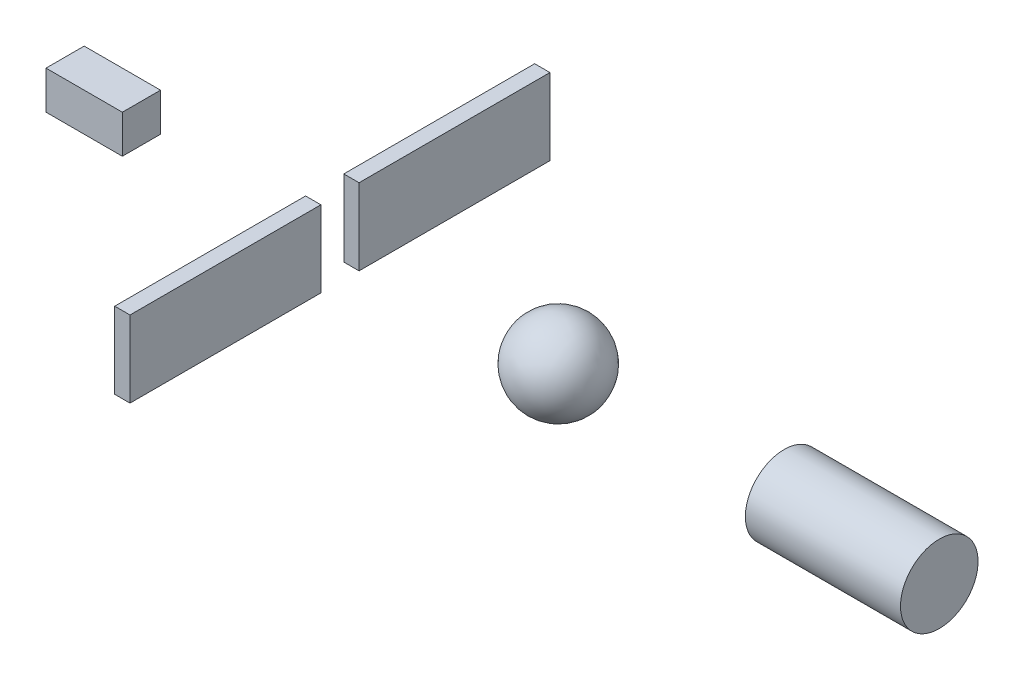
ISO-10303-21;
HEADER;
FILE_DESCRIPTION(('STEP AP214'),'2;1');
FILE_NAME('part.step','',(''),(''),'','','');
FILE_SCHEMA(('AUTOMOTIVE_DESIGN { 1 0 10303 214 1 1 1 1 }'));
ENDSEC;
DATA;
#1=APPLICATION_CONTEXT('core data for automotive mechanical design processes');
#2=APPLICATION_PROTOCOL_DEFINITION('international standard','automotive_design',2000,#1);
#3=PRODUCT_CONTEXT('',#1,'mechanical');
#4=PRODUCT('Part','Part','',(#3));
#5=PRODUCT_RELATED_PRODUCT_CATEGORY('part','',(#4));
#6=PRODUCT_DEFINITION_FORMATION('','',#4);
#7=PRODUCT_DEFINITION_CONTEXT('part definition',#1,'design');
#8=PRODUCT_DEFINITION('design','',#6,#7);
#9=PRODUCT_DEFINITION_SHAPE('','',#8);
#10=(LENGTH_UNIT() NAMED_UNIT(*) SI_UNIT(.MILLI.,.METRE.));
#11=(NAMED_UNIT(*) PLANE_ANGLE_UNIT() SI_UNIT($,.RADIAN.));
#12=(NAMED_UNIT(*) SI_UNIT($,.STERADIAN.) SOLID_ANGLE_UNIT());
#13=UNCERTAINTY_MEASURE_WITH_UNIT(LENGTH_MEASURE(1.E-05),#10,'distance_accuracy_value','');
#14=(GEOMETRIC_REPRESENTATION_CONTEXT(3) GLOBAL_UNCERTAINTY_ASSIGNED_CONTEXT((#13)) GLOBAL_UNIT_ASSIGNED_CONTEXT((#10,
#11,#12)) REPRESENTATION_CONTEXT('',''));
#15=CARTESIAN_POINT('',(0.,0.,0.));
#16=DIRECTION('',(0.,0.,1.));
#17=DIRECTION('',(1.,0.,0.));
#18=AXIS2_PLACEMENT_3D('',#15,#16,#17);
#19=CARTESIAN_POINT('',(9.99999999999998,50.,275.));
#20=DIRECTION('',(-1.,0.,0.));
#21=DIRECTION('',(0.,0.,1.));
#22=AXIS2_PLACEMENT_3D('',#19,#20,#21);
#23=PLANE('',#22);
#24=DIRECTION('',(0.,0.,-1.));
#25=VECTOR('',#24,1.);
#26=CARTESIAN_POINT('',(9.99999999999998,-50.,275.));
#27=LINE('',#26,#25);
#28=CARTESIAN_POINT('',(9.99999999999998,-50.,275.));
#29=VERTEX_POINT('',#28);
#30=CARTESIAN_POINT('',(10.,-50.,25.));
#31=VERTEX_POINT('',#30);
#32=EDGE_CURVE('E107',#29,#31,#27,.T.);
#33=ORIENTED_EDGE('',*,*,#32,.T.);
#34=DIRECTION('',(0.,-1.,0.));
#35=VECTOR('',#34,1.);
#36=CARTESIAN_POINT('',(10.,50.,25.));
#37=LINE('',#36,#35);
#38=CARTESIAN_POINT('',(10.,50.,25.));
#39=VERTEX_POINT('',#38);
#40=EDGE_CURVE('E12',#39,#31,#37,.T.);
#41=ORIENTED_EDGE('',*,*,#40,.F.);
#42=DIRECTION('',(0.,0.,-1.));
#43=VECTOR('',#42,1.);
#44=CARTESIAN_POINT('',(9.99999999999998,50.,275.));
#45=LINE('',#44,#43);
#46=CARTESIAN_POINT('',(9.99999999999998,50.,275.));
#47=VERTEX_POINT('',#46);
#48=EDGE_CURVE('E95',#47,#39,#45,.T.);
#49=ORIENTED_EDGE('',*,*,#48,.F.);
#50=DIRECTION('',(0.,-1.,0.));
#51=VECTOR('',#50,1.);
#52=CARTESIAN_POINT('',(9.99999999999998,50.,275.));
#53=LINE('',#52,#51);
#54=EDGE_CURVE('E103',#47,#29,#53,.T.);
#55=ORIENTED_EDGE('',*,*,#54,.T.);
#56=EDGE_LOOP('',(#33,#41,#49,#55));
#57=FACE_BOUND('',#56,.T.);
#58=ADVANCED_FACE('F44',(#57),#23,.F.);
#59=CARTESIAN_POINT('',(10.,50.,25.));
#60=DIRECTION('',(0.,0.,1.));
#61=DIRECTION('',(1.,0.,0.));
#62=AXIS2_PLACEMENT_3D('',#59,#60,#61);
#63=PLANE('',#62);
#64=DIRECTION('',(-1.,0.,0.));
#65=VECTOR('',#64,1.);
#66=CARTESIAN_POINT('',(10.,-50.,25.));
#67=LINE('',#66,#65);
#68=CARTESIAN_POINT('',(-9.99999999999998,-50.,25.));
#69=VERTEX_POINT('',#68);
#70=EDGE_CURVE('E99',#31,#69,#67,.T.);
#71=ORIENTED_EDGE('',*,*,#70,.T.);
#72=DIRECTION('',(0.,-1.,0.));
#73=VECTOR('',#72,1.);
#74=CARTESIAN_POINT('',(-9.99999999999998,50.,25.));
#75=LINE('',#74,#73);
#76=CARTESIAN_POINT('',(-9.99999999999998,50.,25.));
#77=VERTEX_POINT('',#76);
#78=EDGE_CURVE('E52',#77,#69,#75,.T.);
#79=ORIENTED_EDGE('',*,*,#78,.F.);
#80=DIRECTION('',(-1.,0.,0.));
#81=VECTOR('',#80,1.);
#82=CARTESIAN_POINT('',(10.,50.,25.));
#83=LINE('',#82,#81);
#84=EDGE_CURVE('E90',#39,#77,#83,.T.);
#85=ORIENTED_EDGE('',*,*,#84,.F.);
#86=ORIENTED_EDGE('',*,*,#40,.T.);
#87=EDGE_LOOP('',(#71,#79,#85,#86));
#88=FACE_BOUND('',#87,.T.);
#89=ADVANCED_FACE('F98',(#88),#63,.F.);
#90=CARTESIAN_POINT('',(-10.,50.,275.));
#91=DIRECTION('',(1.,0.,0.));
#92=DIRECTION('',(0.,0.,-1.));
#93=AXIS2_PLACEMENT_3D('',#90,#91,#92);
#94=PLANE('',#93);
#95=DIRECTION('',(0.,0.,1.));
#96=VECTOR('',#95,1.);
#97=CARTESIAN_POINT('',(-10.,-50.,275.));
#98=LINE('',#97,#96);
#99=CARTESIAN_POINT('',(-10.,-50.,275.));
#100=VERTEX_POINT('',#99);
#101=EDGE_CURVE('E77',#69,#100,#98,.T.);
#102=ORIENTED_EDGE('',*,*,#101,.T.);
#103=DIRECTION('',(0.,-1.,0.));
#104=VECTOR('',#103,1.);
#105=CARTESIAN_POINT('',(-10.,50.,275.));
#106=LINE('',#105,#104);
#107=CARTESIAN_POINT('',(-10.,50.,275.));
#108=VERTEX_POINT('',#107);
#109=EDGE_CURVE('E100',#108,#100,#106,.T.);
#110=ORIENTED_EDGE('',*,*,#109,.F.);
#111=DIRECTION('',(0.,0.,1.));
#112=VECTOR('',#111,1.);
#113=CARTESIAN_POINT('',(-10.,50.,275.));
#114=LINE('',#113,#112);
#115=EDGE_CURVE('E93',#77,#108,#114,.T.);
#116=ORIENTED_EDGE('',*,*,#115,.F.);
#117=ORIENTED_EDGE('',*,*,#78,.T.);
#118=EDGE_LOOP('',(#102,#110,#116,#117));
#119=FACE_BOUND('',#118,.T.);
#120=ADVANCED_FACE('F101',(#119),#94,.F.);
#121=CARTESIAN_POINT('',(9.99999999999998,50.,275.));
#122=DIRECTION('',(0.,0.,-1.));
#123=DIRECTION('',(-1.,0.,0.));
#124=AXIS2_PLACEMENT_3D('',#121,#122,#123);
#125=PLANE('',#124);
#126=DIRECTION('',(1.,0.,0.));
#127=VECTOR('',#126,1.);
#128=CARTESIAN_POINT('',(9.99999999999998,-50.,275.));
#129=LINE('',#128,#127);
#130=EDGE_CURVE('E83',#100,#29,#129,.T.);
#131=ORIENTED_EDGE('',*,*,#130,.T.);
#132=ORIENTED_EDGE('',*,*,#54,.F.);
#133=DIRECTION('',(1.,0.,0.));
#134=VECTOR('',#133,1.);
#135=CARTESIAN_POINT('',(9.99999999999998,50.,275.));
#136=LINE('',#135,#134);
#137=EDGE_CURVE('E60',#108,#47,#136,.T.);
#138=ORIENTED_EDGE('',*,*,#137,.F.);
#139=ORIENTED_EDGE('',*,*,#109,.T.);
#140=EDGE_LOOP('',(#131,#132,#138,#139));
#141=FACE_BOUND('',#140,.T.);
#142=ADVANCED_FACE('F114',(#141),#125,.F.);
#143=CARTESIAN_POINT('',(0.,50.,0.));
#144=DIRECTION('',(0.,1.,0.));
#145=DIRECTION('',(0.,0.,1.));
#146=AXIS2_PLACEMENT_3D('',#143,#144,#145);
#147=PLANE('',#146);
#148=ORIENTED_EDGE('',*,*,#48,.T.);
#149=ORIENTED_EDGE('',*,*,#84,.T.);
#150=ORIENTED_EDGE('',*,*,#115,.T.);
#151=ORIENTED_EDGE('',*,*,#137,.T.);
#152=EDGE_LOOP('',(#148,#149,#150,#151));
#153=FACE_BOUND('',#152,.T.);
#154=ADVANCED_FACE('F91',(#153),#147,.T.);
#155=CARTESIAN_POINT('',(0.,-50.,0.));
#156=DIRECTION('',(0.,1.,0.));
#157=DIRECTION('',(0.,0.,1.));
#158=AXIS2_PLACEMENT_3D('',#155,#156,#157);
#159=PLANE('',#158);
#160=ORIENTED_EDGE('',*,*,#32,.F.);
#161=ORIENTED_EDGE('',*,*,#130,.F.);
#162=ORIENTED_EDGE('',*,*,#101,.F.);
#163=ORIENTED_EDGE('',*,*,#70,.F.);
#164=EDGE_LOOP('',(#160,#161,#162,#163));
#165=FACE_BOUND('',#164,.T.);
#166=ADVANCED_FACE('F117',(#165),#159,.F.);
#167=CLOSED_SHELL('',(#58,#89,#120,#142,#154,#166));
#168=MANIFOLD_SOLID_BREP('B2',#167);
#169=CARTESIAN_POINT('',(-10.,50.,-275.));
#170=DIRECTION('',(1.,0.,0.));
#171=DIRECTION('',(0.,0.,-1.));
#172=AXIS2_PLACEMENT_3D('',#169,#170,#171);
#173=PLANE('',#172);
#174=DIRECTION('',(0.,0.,1.));
#175=VECTOR('',#174,1.);
#176=CARTESIAN_POINT('',(-10.,-50.,-275.));
#177=LINE('',#176,#175);
#178=CARTESIAN_POINT('',(-10.,-50.,-275.));
#179=VERTEX_POINT('',#178);
#180=CARTESIAN_POINT('',(-9.99999999999999,-50.,-25.));
#181=VERTEX_POINT('',#180);
#182=EDGE_CURVE('E237',#179,#181,#177,.T.);
#183=ORIENTED_EDGE('',*,*,#182,.T.);
#184=DIRECTION('',(0.,-1.,0.));
#185=VECTOR('',#184,1.);
#186=CARTESIAN_POINT('',(-9.99999999999999,50.,-25.));
#187=LINE('',#186,#185);
#188=CARTESIAN_POINT('',(-9.99999999999999,50.,-25.));
#189=VERTEX_POINT('',#188);
#190=EDGE_CURVE('E42',#189,#181,#187,.T.);
#191=ORIENTED_EDGE('',*,*,#190,.F.);
#192=DIRECTION('',(0.,0.,1.));
#193=VECTOR('',#192,1.);
#194=CARTESIAN_POINT('',(-10.,50.,-275.));
#195=LINE('',#194,#193);
#196=CARTESIAN_POINT('',(-10.,50.,-275.));
#197=VERTEX_POINT('',#196);
#198=EDGE_CURVE('E225',#197,#189,#195,.T.);
#199=ORIENTED_EDGE('',*,*,#198,.F.);
#200=DIRECTION('',(0.,-1.,0.));
#201=VECTOR('',#200,1.);
#202=CARTESIAN_POINT('',(-10.,50.,-275.));
#203=LINE('',#202,#201);
#204=EDGE_CURVE('E233',#197,#179,#203,.T.);
#205=ORIENTED_EDGE('',*,*,#204,.T.);
#206=EDGE_LOOP('',(#183,#191,#199,#205));
#207=FACE_BOUND('',#206,.T.);
#208=ADVANCED_FACE('F174',(#207),#173,.F.);
#209=CARTESIAN_POINT('',(10.,50.,-25.));
#210=DIRECTION('',(0.,0.,-1.));
#211=DIRECTION('',(-1.,0.,0.));
#212=AXIS2_PLACEMENT_3D('',#209,#210,#211);
#213=PLANE('',#212);
#214=DIRECTION('',(1.,0.,0.));
#215=VECTOR('',#214,1.);
#216=CARTESIAN_POINT('',(10.,-50.,-25.));
#217=LINE('',#216,#215);
#218=CARTESIAN_POINT('',(10.,-50.,-25.));
#219=VERTEX_POINT('',#218);
#220=EDGE_CURVE('E229',#181,#219,#217,.T.);
#221=ORIENTED_EDGE('',*,*,#220,.T.);
#222=DIRECTION('',(0.,-1.,0.));
#223=VECTOR('',#222,1.);
#224=CARTESIAN_POINT('',(10.,50.,-25.));
#225=LINE('',#224,#223);
#226=CARTESIAN_POINT('',(10.,50.,-25.));
#227=VERTEX_POINT('',#226);
#228=EDGE_CURVE('E182',#227,#219,#225,.T.);
#229=ORIENTED_EDGE('',*,*,#228,.F.);
#230=DIRECTION('',(1.,0.,0.));
#231=VECTOR('',#230,1.);
#232=CARTESIAN_POINT('',(10.,50.,-25.));
#233=LINE('',#232,#231);
#234=EDGE_CURVE('E220',#189,#227,#233,.T.);
#235=ORIENTED_EDGE('',*,*,#234,.F.);
#236=ORIENTED_EDGE('',*,*,#190,.T.);
#237=EDGE_LOOP('',(#221,#229,#235,#236));
#238=FACE_BOUND('',#237,.T.);
#239=ADVANCED_FACE('F228',(#238),#213,.F.);
#240=CARTESIAN_POINT('',(9.99999999999998,50.,-275.));
#241=DIRECTION('',(-1.,0.,0.));
#242=DIRECTION('',(0.,0.,1.));
#243=AXIS2_PLACEMENT_3D('',#240,#241,#242);
#244=PLANE('',#243);
#245=DIRECTION('',(0.,0.,-1.));
#246=VECTOR('',#245,1.);
#247=CARTESIAN_POINT('',(9.99999999999998,-50.,-275.));
#248=LINE('',#247,#246);
#249=CARTESIAN_POINT('',(9.99999999999998,-50.,-275.));
#250=VERTEX_POINT('',#249);
#251=EDGE_CURVE('E207',#219,#250,#248,.T.);
#252=ORIENTED_EDGE('',*,*,#251,.T.);
#253=DIRECTION('',(0.,-1.,0.));
#254=VECTOR('',#253,1.);
#255=CARTESIAN_POINT('',(9.99999999999998,50.,-275.));
#256=LINE('',#255,#254);
#257=CARTESIAN_POINT('',(9.99999999999998,50.,-275.));
#258=VERTEX_POINT('',#257);
#259=EDGE_CURVE('E230',#258,#250,#256,.T.);
#260=ORIENTED_EDGE('',*,*,#259,.F.);
#261=DIRECTION('',(0.,0.,-1.));
#262=VECTOR('',#261,1.);
#263=CARTESIAN_POINT('',(9.99999999999998,50.,-275.));
#264=LINE('',#263,#262);
#265=EDGE_CURVE('E223',#227,#258,#264,.T.);
#266=ORIENTED_EDGE('',*,*,#265,.F.);
#267=ORIENTED_EDGE('',*,*,#228,.T.);
#268=EDGE_LOOP('',(#252,#260,#266,#267));
#269=FACE_BOUND('',#268,.T.);
#270=ADVANCED_FACE('F231',(#269),#244,.F.);
#271=CARTESIAN_POINT('',(9.99999999999998,50.,-275.));
#272=DIRECTION('',(0.,0.,1.));
#273=DIRECTION('',(1.,0.,0.));
#274=AXIS2_PLACEMENT_3D('',#271,#272,#273);
#275=PLANE('',#274);
#276=DIRECTION('',(-1.,0.,0.));
#277=VECTOR('',#276,1.);
#278=CARTESIAN_POINT('',(9.99999999999998,-50.,-275.));
#279=LINE('',#278,#277);
#280=EDGE_CURVE('E213',#250,#179,#279,.T.);
#281=ORIENTED_EDGE('',*,*,#280,.T.);
#282=ORIENTED_EDGE('',*,*,#204,.F.);
#283=DIRECTION('',(-1.,0.,0.));
#284=VECTOR('',#283,1.);
#285=CARTESIAN_POINT('',(9.99999999999998,50.,-275.));
#286=LINE('',#285,#284);
#287=EDGE_CURVE('E190',#258,#197,#286,.T.);
#288=ORIENTED_EDGE('',*,*,#287,.F.);
#289=ORIENTED_EDGE('',*,*,#259,.T.);
#290=EDGE_LOOP('',(#281,#282,#288,#289));
#291=FACE_BOUND('',#290,.T.);
#292=ADVANCED_FACE('F244',(#291),#275,.F.);
#293=CARTESIAN_POINT('',(0.,50.,0.));
#294=DIRECTION('',(0.,-1.,0.));
#295=DIRECTION('',(0.,0.,-1.));
#296=AXIS2_PLACEMENT_3D('',#293,#294,#295);
#297=PLANE('',#296);
#298=ORIENTED_EDGE('',*,*,#198,.T.);
#299=ORIENTED_EDGE('',*,*,#234,.T.);
#300=ORIENTED_EDGE('',*,*,#265,.T.);
#301=ORIENTED_EDGE('',*,*,#287,.T.);
#302=EDGE_LOOP('',(#298,#299,#300,#301));
#303=FACE_BOUND('',#302,.T.);
#304=ADVANCED_FACE('F221',(#303),#297,.F.);
#305=CARTESIAN_POINT('',(0.,-50.,0.));
#306=DIRECTION('',(0.,-1.,0.));
#307=DIRECTION('',(0.,0.,-1.));
#308=AXIS2_PLACEMENT_3D('',#305,#306,#307);
#309=PLANE('',#308);
#310=ORIENTED_EDGE('',*,*,#182,.F.);
#311=ORIENTED_EDGE('',*,*,#280,.F.);
#312=ORIENTED_EDGE('',*,*,#251,.F.);
#313=ORIENTED_EDGE('',*,*,#220,.F.);
#314=EDGE_LOOP('',(#310,#311,#312,#313));
#315=FACE_BOUND('',#314,.T.);
#316=ADVANCED_FACE('F247',(#315),#309,.T.);
#317=CLOSED_SHELL('',(#208,#239,#270,#292,#304,#316));
#318=MANIFOLD_SOLID_BREP('B6',#317);
#319=CARTESIAN_POINT('',(295.85,0.,0.));
#320=DIRECTION('',(-1.,0.,0.));
#321=DIRECTION('',(0.,0.,-1.));
#322=AXIS2_PLACEMENT_3D('',#319,#320,#321);
#323=SPHERICAL_SURFACE('',#322,55.85);
#324=CARTESIAN_POINT('',(240.,0.,0.));
#325=VERTEX_POINT('',#324);
#326=VERTEX_LOOP('',#325);
#327=FACE_BOUND('',#326,.T.);
#328=ADVANCED_FACE('F306',(#327),#323,.T.);
#329=CLOSED_SHELL('',(#328));
#330=MANIFOLD_SOLID_BREP('B36',#329);
#331=CARTESIAN_POINT('',(794.9,0.,0.));
#332=DIRECTION('',(-1.,0.,0.));
#333=DIRECTION('',(0.,0.,1.));
#334=AXIS2_PLACEMENT_3D('',#331,#332,#333);
#335=PLANE('',#334);
#336=CARTESIAN_POINT('',(794.9,0.,0.));
#337=DIRECTION('',(-1.,0.,0.));
#338=DIRECTION('',(0.,0.,1.));
#339=AXIS2_PLACEMENT_3D('',#336,#337,#338);
#340=CIRCLE('',#339,50.8);
#341=CARTESIAN_POINT('',(794.9,0.,50.8));
#342=VERTEX_POINT('',#341);
#343=EDGE_CURVE('E334',#342,#342,#340,.T.);
#344=ORIENTED_EDGE('',*,*,#343,.F.);
#345=EDGE_LOOP('',(#344));
#346=FACE_BOUND('',#345,.T.);
#347=ADVANCED_FACE('F328',(#346),#335,.F.);
#348=CARTESIAN_POINT('',(591.7,0.,0.));
#349=DIRECTION('',(1.,0.,0.));
#350=DIRECTION('',(0.,0.,-1.));
#351=AXIS2_PLACEMENT_3D('',#348,#349,#350);
#352=PLANE('',#351);
#353=CARTESIAN_POINT('',(591.7,0.,0.));
#354=DIRECTION('',(-1.,0.,0.));
#355=DIRECTION('',(0.,0.,1.));
#356=AXIS2_PLACEMENT_3D('',#353,#354,#355);
#357=CIRCLE('',#356,50.8);
#358=CARTESIAN_POINT('',(591.7,0.,50.8));
#359=VERTEX_POINT('',#358);
#360=EDGE_CURVE('E305',#359,#359,#357,.T.);
#361=ORIENTED_EDGE('',*,*,#360,.T.);
#362=EDGE_LOOP('',(#361));
#363=FACE_BOUND('',#362,.T.);
#364=ADVANCED_FACE('F343',(#363),#352,.F.);
#365=CARTESIAN_POINT('',(0.,0.,0.));
#366=DIRECTION('',(-1.,0.,0.));
#367=DIRECTION('',(0.,0.,1.));
#368=AXIS2_PLACEMENT_3D('',#365,#366,#367);
#369=CYLINDRICAL_SURFACE('',#368,50.8);
#370=ORIENTED_EDGE('',*,*,#360,.F.);
#371=EDGE_LOOP('',(#370));
#372=FACE_BOUND('',#371,.T.);
#373=ORIENTED_EDGE('',*,*,#343,.T.);
#374=EDGE_LOOP('',(#373));
#375=FACE_BOUND('',#374,.T.);
#376=ADVANCED_FACE('F340',(#372,#375),#369,.T.);
#377=CLOSED_SHELL('',(#347,#364,#376));
#378=MANIFOLD_SOLID_BREP('B170',#377);
#379=CARTESIAN_POINT('',(-250.,-25.,25.));
#380=DIRECTION('',(-1.,0.,0.));
#381=DIRECTION('',(0.,0.,1.));
#382=AXIS2_PLACEMENT_3D('',#379,#380,#381);
#383=PLANE('',#382);
#384=DIRECTION('',(0.,1.,0.));
#385=VECTOR('',#384,1.);
#386=CARTESIAN_POINT('',(-250.,-25.,-25.));
#387=LINE('',#386,#385);
#388=CARTESIAN_POINT('',(-250.,-25.,-25.));
#389=VERTEX_POINT('',#388);
#390=CARTESIAN_POINT('',(-250.,25.,-25.));
#391=VERTEX_POINT('',#390);
#392=EDGE_CURVE('E432',#389,#391,#387,.T.);
#393=ORIENTED_EDGE('',*,*,#392,.T.);
#394=DIRECTION('',(0.,0.,-1.));
#395=VECTOR('',#394,1.);
#396=CARTESIAN_POINT('',(-250.,25.,25.));
#397=LINE('',#396,#395);
#398=CARTESIAN_POINT('',(-250.,25.,25.));
#399=VERTEX_POINT('',#398);
#400=EDGE_CURVE('E326',#399,#391,#397,.T.);
#401=ORIENTED_EDGE('',*,*,#400,.F.);
#402=DIRECTION('',(0.,1.,0.));
#403=VECTOR('',#402,1.);
#404=CARTESIAN_POINT('',(-250.,-25.,25.));
#405=LINE('',#404,#403);
#406=CARTESIAN_POINT('',(-250.,-25.,25.));
#407=VERTEX_POINT('',#406);
#408=EDGE_CURVE('E420',#407,#399,#405,.T.);
#409=ORIENTED_EDGE('',*,*,#408,.F.);
#410=DIRECTION('',(0.,0.,-1.));
#411=VECTOR('',#410,1.);
#412=CARTESIAN_POINT('',(-250.,-25.,25.));
#413=LINE('',#412,#411);
#414=EDGE_CURVE('E428',#407,#389,#413,.T.);
#415=ORIENTED_EDGE('',*,*,#414,.T.);
#416=EDGE_LOOP('',(#393,#401,#409,#415));
#417=FACE_BOUND('',#416,.T.);
#418=ADVANCED_FACE('F369',(#417),#383,.F.);
#419=CARTESIAN_POINT('',(-350.,25.,25.));
#420=DIRECTION('',(0.,-1.,0.));
#421=DIRECTION('',(0.,0.,-1.));
#422=AXIS2_PLACEMENT_3D('',#419,#420,#421);
#423=PLANE('',#422);
#424=DIRECTION('',(-1.,0.,0.));
#425=VECTOR('',#424,1.);
#426=CARTESIAN_POINT('',(-350.,25.,-25.));
#427=LINE('',#426,#425);
#428=CARTESIAN_POINT('',(-350.,25.,-25.));
#429=VERTEX_POINT('',#428);
#430=EDGE_CURVE('E424',#391,#429,#427,.T.);
#431=ORIENTED_EDGE('',*,*,#430,.T.);
#432=DIRECTION('',(0.,0.,-1.));
#433=VECTOR('',#432,1.);
#434=CARTESIAN_POINT('',(-350.,25.,25.));
#435=LINE('',#434,#433);
#436=CARTESIAN_POINT('',(-350.,25.,25.));
#437=VERTEX_POINT('',#436);
#438=EDGE_CURVE('E377',#437,#429,#435,.T.);
#439=ORIENTED_EDGE('',*,*,#438,.F.);
#440=DIRECTION('',(-1.,0.,0.));
#441=VECTOR('',#440,1.);
#442=CARTESIAN_POINT('',(-350.,25.,25.));
#443=LINE('',#442,#441);
#444=EDGE_CURVE('E415',#399,#437,#443,.T.);
#445=ORIENTED_EDGE('',*,*,#444,.F.);
#446=ORIENTED_EDGE('',*,*,#400,.T.);
#447=EDGE_LOOP('',(#431,#439,#445,#446));
#448=FACE_BOUND('',#447,.T.);
#449=ADVANCED_FACE('F423',(#448),#423,.F.);
#450=CARTESIAN_POINT('',(-350.,-25.,25.));
#451=DIRECTION('',(1.,0.,0.));
#452=DIRECTION('',(0.,0.,-1.));
#453=AXIS2_PLACEMENT_3D('',#450,#451,#452);
#454=PLANE('',#453);
#455=DIRECTION('',(0.,-1.,0.));
#456=VECTOR('',#455,1.);
#457=CARTESIAN_POINT('',(-350.,-25.,-25.));
#458=LINE('',#457,#456);
#459=CARTESIAN_POINT('',(-350.,-25.,-25.));
#460=VERTEX_POINT('',#459);
#461=EDGE_CURVE('E402',#429,#460,#458,.T.);
#462=ORIENTED_EDGE('',*,*,#461,.T.);
#463=DIRECTION('',(0.,0.,-1.));
#464=VECTOR('',#463,1.);
#465=CARTESIAN_POINT('',(-350.,-25.,25.));
#466=LINE('',#465,#464);
#467=CARTESIAN_POINT('',(-350.,-25.,25.));
#468=VERTEX_POINT('',#467);
#469=EDGE_CURVE('E425',#468,#460,#466,.T.);
#470=ORIENTED_EDGE('',*,*,#469,.F.);
#471=DIRECTION('',(0.,-1.,0.));
#472=VECTOR('',#471,1.);
#473=CARTESIAN_POINT('',(-350.,-25.,25.));
#474=LINE('',#473,#472);
#475=EDGE_CURVE('E418',#437,#468,#474,.T.);
#476=ORIENTED_EDGE('',*,*,#475,.F.);
#477=ORIENTED_EDGE('',*,*,#438,.T.);
#478=EDGE_LOOP('',(#462,#470,#476,#477));
#479=FACE_BOUND('',#478,.T.);
#480=ADVANCED_FACE('F426',(#479),#454,.F.);
#481=CARTESIAN_POINT('',(-350.,-25.,25.));
#482=DIRECTION('',(0.,1.,0.));
#483=DIRECTION('',(0.,0.,1.));
#484=AXIS2_PLACEMENT_3D('',#481,#482,#483);
#485=PLANE('',#484);
#486=DIRECTION('',(1.,0.,0.));
#487=VECTOR('',#486,1.);
#488=CARTESIAN_POINT('',(-350.,-25.,-25.));
#489=LINE('',#488,#487);
#490=EDGE_CURVE('E408',#460,#389,#489,.T.);
#491=ORIENTED_EDGE('',*,*,#490,.T.);
#492=ORIENTED_EDGE('',*,*,#414,.F.);
#493=DIRECTION('',(1.,0.,0.));
#494=VECTOR('',#493,1.);
#495=CARTESIAN_POINT('',(-350.,-25.,25.));
#496=LINE('',#495,#494);
#497=EDGE_CURVE('E385',#468,#407,#496,.T.);
#498=ORIENTED_EDGE('',*,*,#497,.F.);
#499=ORIENTED_EDGE('',*,*,#469,.T.);
#500=EDGE_LOOP('',(#491,#492,#498,#499));
#501=FACE_BOUND('',#500,.T.);
#502=ADVANCED_FACE('F439',(#501),#485,.F.);
#503=CARTESIAN_POINT('',(0.,0.,25.));
#504=DIRECTION('',(0.,0.,-1.));
#505=DIRECTION('',(-1.,0.,0.));
#506=AXIS2_PLACEMENT_3D('',#503,#504,#505);
#507=PLANE('',#506);
#508=ORIENTED_EDGE('',*,*,#408,.T.);
#509=ORIENTED_EDGE('',*,*,#444,.T.);
#510=ORIENTED_EDGE('',*,*,#475,.T.);
#511=ORIENTED_EDGE('',*,*,#497,.T.);
#512=EDGE_LOOP('',(#508,#509,#510,#511));
#513=FACE_BOUND('',#512,.T.);
#514=ADVANCED_FACE('F416',(#513),#507,.F.);
#515=CARTESIAN_POINT('',(0.,0.,-25.));
#516=DIRECTION('',(0.,0.,-1.));
#517=DIRECTION('',(-1.,0.,0.));
#518=AXIS2_PLACEMENT_3D('',#515,#516,#517);
#519=PLANE('',#518);
#520=ORIENTED_EDGE('',*,*,#392,.F.);
#521=ORIENTED_EDGE('',*,*,#490,.F.);
#522=ORIENTED_EDGE('',*,*,#461,.F.);
#523=ORIENTED_EDGE('',*,*,#430,.F.);
#524=EDGE_LOOP('',(#520,#521,#522,#523));
#525=FACE_BOUND('',#524,.T.);
#526=ADVANCED_FACE('F442',(#525),#519,.T.);
#527=CLOSED_SHELL('',(#418,#449,#480,#502,#514,#526));
#528=MANIFOLD_SOLID_BREP('B300',#527);
#529=ADVANCED_BREP_SHAPE_REPRESENTATION('',(#18,#168,#318,#330,#378,#528),#14);
#530=SHAPE_DEFINITION_REPRESENTATION(#9,#529);
ENDSEC;
END-ISO-10303-21;
